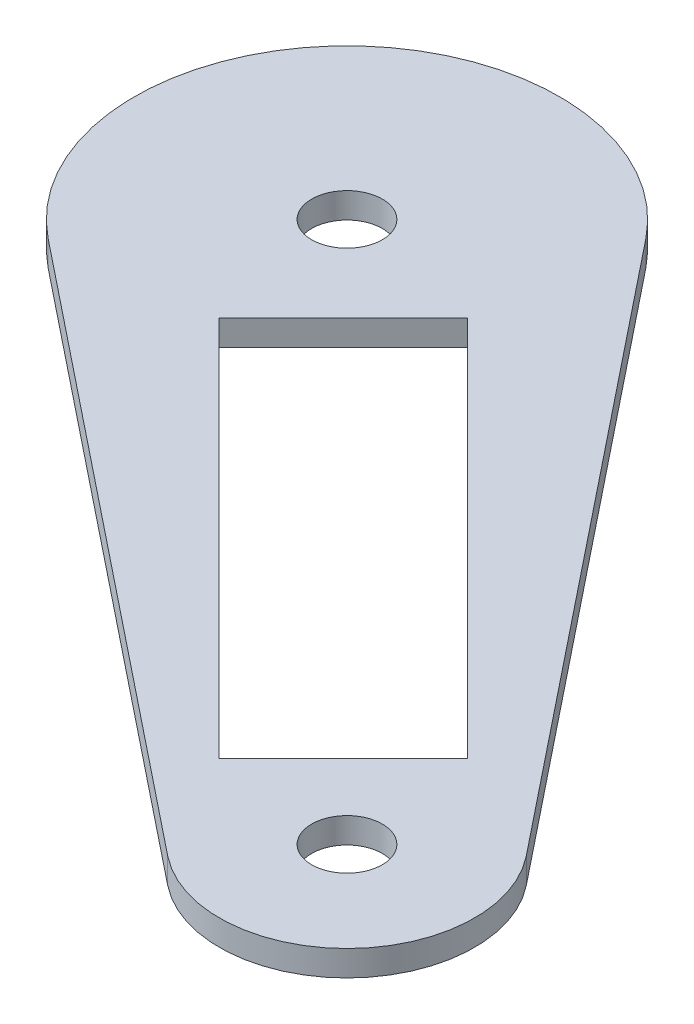
ISO-10303-21;
HEADER;
FILE_DESCRIPTION(('STEP AP214'),'2;1');
FILE_NAME('part.step','',(''),(''),'','','');
FILE_SCHEMA(('AUTOMOTIVE_DESIGN { 1 0 10303 214 1 1 1 1 }'));
ENDSEC;
DATA;
#1=APPLICATION_CONTEXT('core data for automotive mechanical design processes');
#2=APPLICATION_PROTOCOL_DEFINITION('international standard','automotive_design',2000,#1);
#3=PRODUCT_CONTEXT('',#1,'mechanical');
#4=PRODUCT('Part','Part','',(#3));
#5=PRODUCT_RELATED_PRODUCT_CATEGORY('part','',(#4));
#6=PRODUCT_DEFINITION_FORMATION('','',#4);
#7=PRODUCT_DEFINITION_CONTEXT('part definition',#1,'design');
#8=PRODUCT_DEFINITION('design','',#6,#7);
#9=PRODUCT_DEFINITION_SHAPE('','',#8);
#10=(LENGTH_UNIT() NAMED_UNIT(*) SI_UNIT(.MILLI.,.METRE.));
#11=(NAMED_UNIT(*) PLANE_ANGLE_UNIT() SI_UNIT($,.RADIAN.));
#12=(NAMED_UNIT(*) SI_UNIT($,.STERADIAN.) SOLID_ANGLE_UNIT());
#13=UNCERTAINTY_MEASURE_WITH_UNIT(LENGTH_MEASURE(1.E-05),#10,'distance_accuracy_value','');
#14=(GEOMETRIC_REPRESENTATION_CONTEXT(3) GLOBAL_UNCERTAINTY_ASSIGNED_CONTEXT((#13)) GLOBAL_UNIT_ASSIGNED_CONTEXT((#10,
#11,#12)) REPRESENTATION_CONTEXT('',''));
#15=CARTESIAN_POINT('',(0.,0.,0.));
#16=DIRECTION('',(0.,0.,1.));
#17=DIRECTION('',(1.,0.,0.));
#18=AXIS2_PLACEMENT_3D('',#15,#16,#17);
#19=CARTESIAN_POINT('',(-15.6040237198615,3.,19.5323947264538));
#20=DIRECTION('',(0.624160948794458,0.,-0.781295789058153));
#21=DIRECTION('',(-0.781295789058153,0.,-0.624160948794458));
#22=AXIS2_PLACEMENT_3D('',#19,#20,#21);
#23=PLANE('',#22);
#24=DIRECTION('',(0.781295789058153,0.,0.624160948794458));
#25=VECTOR('',#24,1.);
#26=CARTESIAN_POINT('',(-15.6040237198615,3.,19.5323947264538));
#27=LINE('',#26,#25);
#28=CARTESIAN_POINT('',(-15.6040237198615,3.,19.5323947264538));
#29=VERTEX_POINT('',#28);
#30=CARTESIAN_POINT('',(54.2771960748732,3.,75.3590471426608));
#31=VERTEX_POINT('',#30);
#32=EDGE_CURVE('E109',#29,#31,#27,.T.);
#33=ORIENTED_EDGE('',*,*,#32,.F.);
#34=DIRECTION('',(0.,-1.,0.));
#35=VECTOR('',#34,1.);
#36=CARTESIAN_POINT('',(-15.6040237198615,3.,19.5323947264538));
#37=LINE('',#36,#35);
#38=CARTESIAN_POINT('',(-15.6040237198615,0.,19.5323947264538));
#39=VERTEX_POINT('',#38);
#40=EDGE_CURVE('E129',#29,#39,#37,.T.);
#41=ORIENTED_EDGE('',*,*,#40,.T.);
#42=DIRECTION('',(0.781295789058153,0.,0.624160948794458));
#43=VECTOR('',#42,1.);
#44=CARTESIAN_POINT('',(-15.6040237198615,0.,19.5323947264538));
#45=LINE('',#44,#43);
#46=CARTESIAN_POINT('',(54.2771960748732,0.,75.3590471426608));
#47=VERTEX_POINT('',#46);
#48=EDGE_CURVE('E128',#39,#47,#45,.T.);
#49=ORIENTED_EDGE('',*,*,#48,.T.);
#50=DIRECTION('',(0.,-1.,0.));
#51=VECTOR('',#50,1.);
#52=CARTESIAN_POINT('',(54.2771960748732,3.,75.3590471426608));
#53=LINE('',#52,#51);
#54=EDGE_CURVE('E11',#31,#47,#53,.T.);
#55=ORIENTED_EDGE('',*,*,#54,.F.);
#56=EDGE_LOOP('',(#33,#41,#49,#55));
#57=FACE_BOUND('',#56,.T.);
#58=ADVANCED_FACE('F47',(#57),#23,.F.);
#59=CARTESIAN_POINT('',(63.6396103067901,3.,63.6396103067885));
#60=DIRECTION('',(0.,-1.,0.));
#61=DIRECTION('',(0.,0.,-1.));
#62=AXIS2_PLACEMENT_3D('',#59,#60,#61);
#63=CYLINDRICAL_SURFACE('',#62,15.);
#64=CARTESIAN_POINT('',(63.6396103067901,3.,63.6396103067885));
#65=DIRECTION('',(0.,1.,0.));
#66=DIRECTION('',(0.,0.,1.));
#67=AXIS2_PLACEMENT_3D('',#64,#65,#66);
#68=CIRCLE('',#67,15.);
#69=CARTESIAN_POINT('',(75.3590471426621,3.,54.2771960748713));
#70=VERTEX_POINT('',#69);
#71=EDGE_CURVE('E112',#31,#70,#68,.T.);
#72=ORIENTED_EDGE('',*,*,#71,.F.);
#73=ORIENTED_EDGE('',*,*,#54,.T.);
#74=CARTESIAN_POINT('',(63.6396103067901,0.,63.6396103067885));
#75=DIRECTION('',(0.,1.,0.));
#76=DIRECTION('',(0.,0.,1.));
#77=AXIS2_PLACEMENT_3D('',#74,#75,#76);
#78=CIRCLE('',#77,15.);
#79=CARTESIAN_POINT('',(75.3590471426621,0.,54.2771960748713));
#80=VERTEX_POINT('',#79);
#81=EDGE_CURVE('E134',#47,#80,#78,.T.);
#82=ORIENTED_EDGE('',*,*,#81,.T.);
#83=DIRECTION('',(0.,-1.,0.));
#84=VECTOR('',#83,1.);
#85=CARTESIAN_POINT('',(75.3590471426621,3.,54.2771960748713));
#86=LINE('',#85,#84);
#87=EDGE_CURVE('E55',#70,#80,#86,.T.);
#88=ORIENTED_EDGE('',*,*,#87,.F.);
#89=EDGE_LOOP('',(#72,#73,#82,#88));
#90=FACE_BOUND('',#89,.T.);
#91=ADVANCED_FACE('F121',(#90),#63,.T.);
#92=CARTESIAN_POINT('',(19.5323947264534,3.,-15.6040237198619));
#93=DIRECTION('',(0.781295789058138,0.,-0.624160948794477));
#94=DIRECTION('',(-0.624160948794477,0.,-0.781295789058138));
#95=AXIS2_PLACEMENT_3D('',#92,#93,#94);
#96=PLANE('',#95);
#97=DIRECTION('',(0.,-1.,0.));
#98=VECTOR('',#97,1.);
#99=CARTESIAN_POINT('',(19.5323947264534,3.,-15.6040237198619));
#100=LINE('',#99,#98);
#101=CARTESIAN_POINT('',(19.5323947264534,3.,-15.6040237198619));
#102=VERTEX_POINT('',#101);
#103=CARTESIAN_POINT('',(19.5323947264534,0.,-15.6040237198619));
#104=VERTEX_POINT('',#103);
#105=EDGE_CURVE('E164',#102,#104,#100,.T.);
#106=ORIENTED_EDGE('',*,*,#105,.F.);
#107=DIRECTION('',(-0.624160948794477,0.,-0.781295789058138));
#108=VECTOR('',#107,1.);
#109=CARTESIAN_POINT('',(19.5323947264534,3.,-15.6040237198619));
#110=LINE('',#109,#108);
#111=EDGE_CURVE('E62',#70,#102,#110,.T.);
#112=ORIENTED_EDGE('',*,*,#111,.F.);
#113=ORIENTED_EDGE('',*,*,#87,.T.);
#114=DIRECTION('',(0.624160948794477,0.,0.781295789058138));
#115=VECTOR('',#114,1.);
#116=CARTESIAN_POINT('',(19.5323947264534,0.,-15.6040237198619));
#117=LINE('',#116,#115);
#118=EDGE_CURVE('E139',#104,#80,#117,.T.);
#119=ORIENTED_EDGE('',*,*,#118,.F.);
#120=EDGE_LOOP('',(#106,#112,#113,#119));
#121=FACE_BOUND('',#120,.T.);
#122=ADVANCED_FACE('F170',(#121),#96,.T.);
#123=CARTESIAN_POINT('',(0.,3.,0.));
#124=DIRECTION('',(0.,-1.,0.));
#125=DIRECTION('',(0.,0.,-1.));
#126=AXIS2_PLACEMENT_3D('',#123,#124,#125);
#127=CYLINDRICAL_SURFACE('',#126,25.);
#128=CARTESIAN_POINT('',(0.,3.,0.));
#129=DIRECTION('',(0.,1.,0.));
#130=DIRECTION('',(0.,0.,1.));
#131=AXIS2_PLACEMENT_3D('',#128,#129,#130);
#132=CIRCLE('',#131,25.);
#133=EDGE_CURVE('E113',#102,#29,#132,.T.);
#134=ORIENTED_EDGE('',*,*,#133,.F.);
#135=ORIENTED_EDGE('',*,*,#105,.T.);
#136=CARTESIAN_POINT('',(0.,0.,0.));
#137=DIRECTION('',(0.,1.,0.));
#138=DIRECTION('',(0.,0.,1.));
#139=AXIS2_PLACEMENT_3D('',#136,#137,#138);
#140=CIRCLE('',#139,25.);
#141=EDGE_CURVE('E150',#104,#39,#140,.T.);
#142=ORIENTED_EDGE('',*,*,#141,.T.);
#143=ORIENTED_EDGE('',*,*,#40,.F.);
#144=EDGE_LOOP('',(#134,#135,#142,#143));
#145=FACE_BOUND('',#144,.T.);
#146=ADVANCED_FACE('F174',(#145),#127,.T.);
#147=CARTESIAN_POINT('',(63.6396103067901,3.,63.6396103067885));
#148=DIRECTION('',(0.,-1.,0.));
#149=DIRECTION('',(0.,0.,-1.));
#150=AXIS2_PLACEMENT_3D('',#147,#148,#149);
#151=CYLINDRICAL_SURFACE('',#150,4.15);
#152=CARTESIAN_POINT('',(63.6396103067901,3.,63.6396103067885));
#153=DIRECTION('',(0.,1.,0.));
#154=DIRECTION('',(0.,0.,1.));
#155=AXIS2_PLACEMENT_3D('',#152,#153,#154);
#156=CIRCLE('',#155,4.15);
#157=CARTESIAN_POINT('',(63.6396103067901,3.,67.7896103067885));
#158=VERTEX_POINT('',#157);
#159=EDGE_CURVE('E161',#158,#158,#156,.T.);
#160=ORIENTED_EDGE('',*,*,#159,.T.);
#161=EDGE_LOOP('',(#160));
#162=FACE_BOUND('',#161,.T.);
#163=CARTESIAN_POINT('',(63.6396103067901,0.,63.6396103067885));
#164=DIRECTION('',(0.,1.,0.));
#165=DIRECTION('',(0.,0.,1.));
#166=AXIS2_PLACEMENT_3D('',#163,#164,#165);
#167=CIRCLE('',#166,4.15);
#168=CARTESIAN_POINT('',(63.6396103067901,0.,67.7896103067885));
#169=VERTEX_POINT('',#168);
#170=EDGE_CURVE('E153',#169,#169,#167,.T.);
#171=ORIENTED_EDGE('',*,*,#170,.F.);
#172=EDGE_LOOP('',(#171));
#173=FACE_BOUND('',#172,.T.);
#174=ADVANCED_FACE('F239',(#162,#173),#151,.F.);
#175=CARTESIAN_POINT('',(0.,3.,0.));
#176=DIRECTION('',(0.,-1.,0.));
#177=DIRECTION('',(0.,0.,-1.));
#178=AXIS2_PLACEMENT_3D('',#175,#176,#177);
#179=CYLINDRICAL_SURFACE('',#178,4.15);
#180=CARTESIAN_POINT('',(0.,3.,0.));
#181=DIRECTION('',(0.,1.,0.));
#182=DIRECTION('',(0.,0.,1.));
#183=AXIS2_PLACEMENT_3D('',#180,#181,#182);
#184=CIRCLE('',#183,4.15);
#185=CARTESIAN_POINT('',(0.,3.,4.15));
#186=VERTEX_POINT('',#185);
#187=EDGE_CURVE('E144',#186,#186,#184,.T.);
#188=ORIENTED_EDGE('',*,*,#187,.T.);
#189=EDGE_LOOP('',(#188));
#190=FACE_BOUND('',#189,.T.);
#191=CARTESIAN_POINT('',(0.,0.,0.));
#192=DIRECTION('',(0.,1.,0.));
#193=DIRECTION('',(0.,0.,1.));
#194=AXIS2_PLACEMENT_3D('',#191,#192,#193);
#195=CIRCLE('',#194,4.15);
#196=CARTESIAN_POINT('',(0.,0.,4.15));
#197=VERTEX_POINT('',#196);
#198=EDGE_CURVE('E157',#197,#197,#195,.T.);
#199=ORIENTED_EDGE('',*,*,#198,.F.);
#200=EDGE_LOOP('',(#199));
#201=FACE_BOUND('',#200,.T.);
#202=ADVANCED_FACE('F225',(#190,#201),#179,.F.);
#203=CARTESIAN_POINT('',(0.,3.,0.));
#204=DIRECTION('',(0.,1.,0.));
#205=DIRECTION('',(0.,0.,1.));
#206=AXIS2_PLACEMENT_3D('',#203,#204,#205);
#207=PLANE('',#206);
#208=DIRECTION('',(-0.707106781186556,0.,-0.707106781186539));
#209=VECTOR('',#208,1.);
#210=CARTESIAN_POINT('',(7.07833510875965,3.,-7.07833510875982));
#211=LINE('',#210,#209);
#212=CARTESIAN_POINT('',(61.9879543253394,3.,47.8312841078186));
#213=VERTEX_POINT('',#212);
#214=CARTESIAN_POINT('',(17.1336623729859,3.,2.97699215546623));
#215=VERTEX_POINT('',#214);
#216=EDGE_CURVE('E70',#213,#215,#211,.T.);
#217=ORIENTED_EDGE('',*,*,#216,.F.);
#218=DIRECTION('',(0.707106781186538,0.,-0.707106781186557));
#219=VECTOR('',#218,1.);
#220=CARTESIAN_POINT('',(54.9096192165798,3.,54.9096192165783));
#221=LINE('',#220,#219);
#222=CARTESIAN_POINT('',(47.3842313641089,3.,62.4350070690494));
#223=VERTEX_POINT('',#222);
#224=EDGE_CURVE('E188',#223,#213,#221,.T.);
#225=ORIENTED_EDGE('',*,*,#224,.F.);
#226=DIRECTION('',(0.707106781186556,0.,0.707106781186539));
#227=VECTOR('',#226,1.);
#228=CARTESIAN_POINT('',(-7.52538785247084,3.,7.52538785247103));
#229=LINE('',#228,#227);
#230=CARTESIAN_POINT('',(2.52993941175545,3.,17.5807151166971));
#231=VERTEX_POINT('',#230);
#232=EDGE_CURVE('E204',#231,#223,#229,.T.);
#233=ORIENTED_EDGE('',*,*,#232,.F.);
#234=DIRECTION('',(-0.707106781186539,0.,0.707106781186556));
#235=VECTOR('',#234,1.);
#236=CARTESIAN_POINT('',(10.0553272642263,3.,10.055327264226));
#237=LINE('',#236,#235);
#238=EDGE_CURVE('E179',#215,#231,#237,.T.);
#239=ORIENTED_EDGE('',*,*,#238,.F.);
#240=EDGE_LOOP('',(#217,#225,#233,#239));
#241=FACE_BOUND('',#240,.T.);
#242=ORIENTED_EDGE('',*,*,#159,.F.);
#243=EDGE_LOOP('',(#242));
#244=FACE_BOUND('',#243,.T.);
#245=ORIENTED_EDGE('',*,*,#187,.F.);
#246=EDGE_LOOP('',(#245));
#247=FACE_BOUND('',#246,.T.);
#248=ORIENTED_EDGE('',*,*,#32,.T.);
#249=ORIENTED_EDGE('',*,*,#71,.T.);
#250=ORIENTED_EDGE('',*,*,#111,.T.);
#251=ORIENTED_EDGE('',*,*,#133,.T.);
#252=EDGE_LOOP('',(#248,#249,#250,#251));
#253=FACE_BOUND('',#252,.T.);
#254=ADVANCED_FACE('F111',(#241,#244,#247,#253),#207,.T.);
#255=CARTESIAN_POINT('',(0.,0.,0.));
#256=DIRECTION('',(0.,1.,0.));
#257=DIRECTION('',(0.,0.,1.));
#258=AXIS2_PLACEMENT_3D('',#255,#256,#257);
#259=PLANE('',#258);
#260=DIRECTION('',(0.707106781186538,0.,-0.707106781186557));
#261=VECTOR('',#260,1.);
#262=CARTESIAN_POINT('',(54.9096192165798,0.,54.9096192165783));
#263=LINE('',#262,#261);
#264=CARTESIAN_POINT('',(47.3842313641089,0.,62.4350070690494));
#265=VERTEX_POINT('',#264);
#266=CARTESIAN_POINT('',(61.9879543253394,0.,47.8312841078186));
#267=VERTEX_POINT('',#266);
#268=EDGE_CURVE('E196',#265,#267,#263,.T.);
#269=ORIENTED_EDGE('',*,*,#268,.T.);
#270=DIRECTION('',(-0.707106781186556,0.,-0.707106781186539));
#271=VECTOR('',#270,1.);
#272=CARTESIAN_POINT('',(7.07833510875965,0.,-7.07833510875982));
#273=LINE('',#272,#271);
#274=CARTESIAN_POINT('',(17.1336623729859,0.,2.97699215546623));
#275=VERTEX_POINT('',#274);
#276=EDGE_CURVE('E183',#267,#275,#273,.T.);
#277=ORIENTED_EDGE('',*,*,#276,.T.);
#278=DIRECTION('',(-0.707106781186539,0.,0.707106781186556));
#279=VECTOR('',#278,1.);
#280=CARTESIAN_POINT('',(10.0553272642263,0.,10.055327264226));
#281=LINE('',#280,#279);
#282=CARTESIAN_POINT('',(2.52993941175545,0.,17.5807151166971));
#283=VERTEX_POINT('',#282);
#284=EDGE_CURVE('E187',#275,#283,#281,.T.);
#285=ORIENTED_EDGE('',*,*,#284,.T.);
#286=DIRECTION('',(0.707106781186556,0.,0.707106781186539));
#287=VECTOR('',#286,1.);
#288=CARTESIAN_POINT('',(-7.52538785247084,0.,7.52538785247103));
#289=LINE('',#288,#287);
#290=EDGE_CURVE('E192',#283,#265,#289,.T.);
#291=ORIENTED_EDGE('',*,*,#290,.T.);
#292=EDGE_LOOP('',(#269,#277,#285,#291));
#293=FACE_BOUND('',#292,.T.);
#294=ORIENTED_EDGE('',*,*,#48,.F.);
#295=ORIENTED_EDGE('',*,*,#141,.F.);
#296=ORIENTED_EDGE('',*,*,#118,.T.);
#297=ORIENTED_EDGE('',*,*,#81,.F.);
#298=EDGE_LOOP('',(#294,#295,#296,#297));
#299=FACE_BOUND('',#298,.T.);
#300=ORIENTED_EDGE('',*,*,#170,.T.);
#301=EDGE_LOOP('',(#300));
#302=FACE_BOUND('',#301,.T.);
#303=ORIENTED_EDGE('',*,*,#198,.T.);
#304=EDGE_LOOP('',(#303));
#305=FACE_BOUND('',#304,.T.);
#306=ADVANCED_FACE('F171',(#293,#299,#302,#305),#259,.F.);
#307=CARTESIAN_POINT('',(7.07833510875965,0.,-7.07833510875982));
#308=DIRECTION('',(0.707106781186539,0.,-0.707106781186556));
#309=DIRECTION('',(-0.707106781186556,0.,-0.707106781186539));
#310=AXIS2_PLACEMENT_3D('',#307,#308,#309);
#311=PLANE('',#310);
#312=ORIENTED_EDGE('',*,*,#216,.T.);
#313=DIRECTION('',(0.,1.,0.));
#314=VECTOR('',#313,1.);
#315=CARTESIAN_POINT('',(17.1336623729859,0.,2.97699215546623));
#316=LINE('',#315,#314);
#317=EDGE_CURVE('E199',#275,#215,#316,.T.);
#318=ORIENTED_EDGE('',*,*,#317,.F.);
#319=ORIENTED_EDGE('',*,*,#276,.F.);
#320=DIRECTION('',(0.,1.,0.));
#321=VECTOR('',#320,1.);
#322=CARTESIAN_POINT('',(61.9879543253394,0.,47.8312841078186));
#323=LINE('',#322,#321);
#324=EDGE_CURVE('E135',#267,#213,#323,.T.);
#325=ORIENTED_EDGE('',*,*,#324,.T.);
#326=EDGE_LOOP('',(#312,#318,#319,#325));
#327=FACE_BOUND('',#326,.T.);
#328=ADVANCED_FACE('F235',(#327),#311,.F.);
#329=CARTESIAN_POINT('',(54.9096192165798,0.,54.9096192165783));
#330=DIRECTION('',(0.707106781186557,0.,0.707106781186538));
#331=DIRECTION('',(0.707106781186538,0.,-0.707106781186557));
#332=AXIS2_PLACEMENT_3D('',#329,#330,#331);
#333=PLANE('',#332);
#334=ORIENTED_EDGE('',*,*,#224,.T.);
#335=ORIENTED_EDGE('',*,*,#324,.F.);
#336=ORIENTED_EDGE('',*,*,#268,.F.);
#337=DIRECTION('',(0.,1.,0.));
#338=VECTOR('',#337,1.);
#339=CARTESIAN_POINT('',(47.3842313641089,0.,62.4350070690494));
#340=LINE('',#339,#338);
#341=EDGE_CURVE('E141',#265,#223,#340,.T.);
#342=ORIENTED_EDGE('',*,*,#341,.T.);
#343=EDGE_LOOP('',(#334,#335,#336,#342));
#344=FACE_BOUND('',#343,.T.);
#345=ADVANCED_FACE('F279',(#344),#333,.F.);
#346=CARTESIAN_POINT('',(-7.52538785247084,0.,7.52538785247103));
#347=DIRECTION('',(-0.707106781186539,0.,0.707106781186556));
#348=DIRECTION('',(0.707106781186556,0.,0.707106781186539));
#349=AXIS2_PLACEMENT_3D('',#346,#347,#348);
#350=PLANE('',#349);
#351=ORIENTED_EDGE('',*,*,#232,.T.);
#352=ORIENTED_EDGE('',*,*,#341,.F.);
#353=ORIENTED_EDGE('',*,*,#290,.F.);
#354=DIRECTION('',(0.,1.,0.));
#355=VECTOR('',#354,1.);
#356=CARTESIAN_POINT('',(2.52993941175545,0.,17.5807151166971));
#357=LINE('',#356,#355);
#358=EDGE_CURVE('E213',#283,#231,#357,.T.);
#359=ORIENTED_EDGE('',*,*,#358,.T.);
#360=EDGE_LOOP('',(#351,#352,#353,#359));
#361=FACE_BOUND('',#360,.T.);
#362=ADVANCED_FACE('F287',(#361),#350,.F.);
#363=CARTESIAN_POINT('',(10.0553272642263,0.,10.055327264226));
#364=DIRECTION('',(-0.707106781186556,0.,-0.707106781186539));
#365=DIRECTION('',(-0.707106781186539,0.,0.707106781186556));
#366=AXIS2_PLACEMENT_3D('',#363,#364,#365);
#367=PLANE('',#366);
#368=ORIENTED_EDGE('',*,*,#238,.T.);
#369=ORIENTED_EDGE('',*,*,#358,.F.);
#370=ORIENTED_EDGE('',*,*,#284,.F.);
#371=ORIENTED_EDGE('',*,*,#317,.T.);
#372=EDGE_LOOP('',(#368,#369,#370,#371));
#373=FACE_BOUND('',#372,.T.);
#374=ADVANCED_FACE('F294',(#373),#367,.F.);
#375=CLOSED_SHELL('',(#58,#91,#122,#146,#174,#202,#254,#306,#328,#345,#362,#374));
#376=MANIFOLD_SOLID_BREP('B2',#375);
#377=ADVANCED_BREP_SHAPE_REPRESENTATION('',(#18,#376),#14);
#378=SHAPE_DEFINITION_REPRESENTATION(#9,#377);
ENDSEC;
END-ISO-10303-21;
